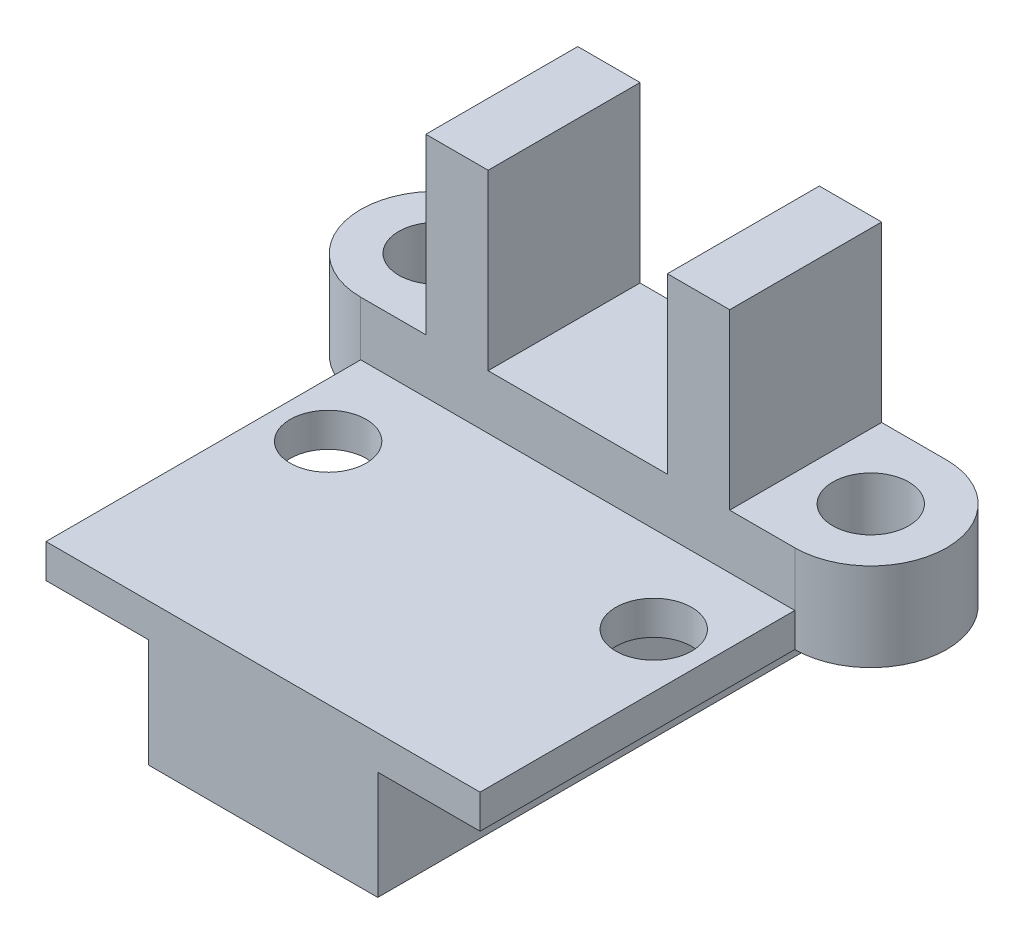
ISO-10303-21;
HEADER;
FILE_DESCRIPTION(('STEP AP214'),'2;1');
FILE_NAME('part.step','',(''),(''),'','','');
FILE_SCHEMA(('AUTOMOTIVE_DESIGN { 1 0 10303 214 1 1 1 1 }'));
ENDSEC;
DATA;
#1=APPLICATION_CONTEXT('core data for automotive mechanical design processes');
#2=APPLICATION_PROTOCOL_DEFINITION('international standard','automotive_design',2000,#1);
#3=PRODUCT_CONTEXT('',#1,'mechanical');
#4=PRODUCT('Part','Part','',(#3));
#5=PRODUCT_RELATED_PRODUCT_CATEGORY('part','',(#4));
#6=PRODUCT_DEFINITION_FORMATION('','',#4);
#7=PRODUCT_DEFINITION_CONTEXT('part definition',#1,'design');
#8=PRODUCT_DEFINITION('design','',#6,#7);
#9=PRODUCT_DEFINITION_SHAPE('','',#8);
#10=(LENGTH_UNIT() NAMED_UNIT(*) SI_UNIT(.MILLI.,.METRE.));
#11=(NAMED_UNIT(*) PLANE_ANGLE_UNIT() SI_UNIT($,.RADIAN.));
#12=(NAMED_UNIT(*) SI_UNIT($,.STERADIAN.) SOLID_ANGLE_UNIT());
#13=UNCERTAINTY_MEASURE_WITH_UNIT(LENGTH_MEASURE(1.E-05),#10,'distance_accuracy_value','');
#14=(GEOMETRIC_REPRESENTATION_CONTEXT(3) GLOBAL_UNCERTAINTY_ASSIGNED_CONTEXT((#13)) GLOBAL_UNIT_ASSIGNED_CONTEXT((#10,
#11,#12)) REPRESENTATION_CONTEXT('',''));
#15=CARTESIAN_POINT('',(0.,0.,0.));
#16=DIRECTION('',(0.,0.,1.));
#17=DIRECTION('',(1.,0.,0.));
#18=AXIS2_PLACEMENT_3D('',#15,#16,#17);
#19=CARTESIAN_POINT('',(10.,0.,-10.75));
#20=DIRECTION('',(0.,1.,0.));
#21=DIRECTION('',(0.,0.,1.));
#22=AXIS2_PLACEMENT_3D('',#19,#20,#21);
#23=PLANE('',#22);
#24=CARTESIAN_POINT('',(7.5,0.,-3.25));
#25=DIRECTION('',(0.,1.,0.));
#26=DIRECTION('',(0.,0.,1.));
#27=AXIS2_PLACEMENT_3D('',#24,#25,#26);
#28=CIRCLE('',#27,1.75);
#29=CARTESIAN_POINT('',(7.5,0.,-5.));
#30=VERTEX_POINT('',#29);
#31=EDGE_CURVE('E341',#30,#30,#28,.T.);
#32=ORIENTED_EDGE('',*,*,#31,.T.);
#33=EDGE_LOOP('',(#32));
#34=FACE_BOUND('',#33,.T.);
#35=CARTESIAN_POINT('',(10.,0.,-10.75));
#36=DIRECTION('',(0.,1.,0.));
#37=DIRECTION('',(0.,0.,1.));
#38=AXIS2_PLACEMENT_3D('',#35,#36,#37);
#39=CIRCLE('',#38,1.75);
#40=CARTESIAN_POINT('',(10.,0.,-12.5));
#41=VERTEX_POINT('',#40);
#42=EDGE_CURVE('E331',#41,#41,#39,.T.);
#43=ORIENTED_EDGE('',*,*,#42,.T.);
#44=EDGE_LOOP('',(#43));
#45=FACE_BOUND('',#44,.T.);
#46=DIRECTION('',(0.,0.,1.));
#47=VECTOR('',#46,1.);
#48=CARTESIAN_POINT('',(5.28598469809103,0.,-14.25));
#49=LINE('',#48,#47);
#50=CARTESIAN_POINT('',(5.28598469809103,0.,-14.25));
#51=VERTEX_POINT('',#50);
#52=CARTESIAN_POINT('',(5.28598469809103,0.,7.25));
#53=VERTEX_POINT('',#52);
#54=EDGE_CURVE('E50',#51,#53,#49,.T.);
#55=ORIENTED_EDGE('',*,*,#54,.F.);
#56=DIRECTION('',(-1.,0.,0.));
#57=VECTOR('',#56,1.);
#58=CARTESIAN_POINT('',(-10.,0.,-14.25));
#59=LINE('',#58,#57);
#60=CARTESIAN_POINT('',(10.,0.,-14.25));
#61=VERTEX_POINT('',#60);
#62=EDGE_CURVE('E216',#61,#51,#59,.T.);
#63=ORIENTED_EDGE('',*,*,#62,.F.);
#64=CARTESIAN_POINT('',(10.,0.,-10.75));
#65=DIRECTION('',(0.,1.,0.));
#66=DIRECTION('',(0.,0.,1.));
#67=AXIS2_PLACEMENT_3D('',#64,#65,#66);
#68=CIRCLE('',#67,3.50000000000001);
#69=CARTESIAN_POINT('',(10.,0.,-7.25));
#70=VERTEX_POINT('',#69);
#71=EDGE_CURVE('E217',#70,#61,#68,.T.);
#72=ORIENTED_EDGE('',*,*,#71,.F.);
#73=DIRECTION('',(0.,0.,-1.));
#74=VECTOR('',#73,1.);
#75=CARTESIAN_POINT('',(10.,0.,7.25));
#76=LINE('',#75,#74);
#77=CARTESIAN_POINT('',(10.,0.,7.25));
#78=VERTEX_POINT('',#77);
#79=EDGE_CURVE('E230',#78,#70,#76,.T.);
#80=ORIENTED_EDGE('',*,*,#79,.F.);
#81=DIRECTION('',(1.,0.,0.));
#82=VECTOR('',#81,1.);
#83=CARTESIAN_POINT('',(-10.,0.,7.25));
#84=LINE('',#83,#82);
#85=EDGE_CURVE('E55',#53,#78,#84,.T.);
#86=ORIENTED_EDGE('',*,*,#85,.F.);
#87=EDGE_LOOP('',(#55,#63,#72,#80,#86));
#88=FACE_BOUND('',#87,.T.);
#89=ADVANCED_FACE('F33',(#34,#45,#88),#23,.F.);
#90=CARTESIAN_POINT('',(-10.,0.,-10.75));
#91=DIRECTION('',(0.,1.,0.));
#92=DIRECTION('',(0.,0.,1.));
#93=AXIS2_PLACEMENT_3D('',#90,#91,#92);
#94=CIRCLE('',#93,1.75);
#95=CARTESIAN_POINT('',(-10.,0.,-12.5));
#96=VERTEX_POINT('',#95);
#97=EDGE_CURVE('E328',#96,#96,#94,.T.);
#98=ORIENTED_EDGE('',*,*,#97,.T.);
#99=EDGE_LOOP('',(#98));
#100=FACE_BOUND('',#99,.T.);
#101=CARTESIAN_POINT('',(-7.5,0.,-3.25));
#102=DIRECTION('',(0.,1.,0.));
#103=DIRECTION('',(0.,0.,1.));
#104=AXIS2_PLACEMENT_3D('',#101,#102,#103);
#105=CIRCLE('',#104,1.75);
#106=CARTESIAN_POINT('',(-7.5,0.,-5.));
#107=VERTEX_POINT('',#106);
#108=EDGE_CURVE('E335',#107,#107,#105,.T.);
#109=ORIENTED_EDGE('',*,*,#108,.T.);
#110=EDGE_LOOP('',(#109));
#111=FACE_BOUND('',#110,.T.);
#112=DIRECTION('',(0.,0.,-1.));
#113=VECTOR('',#112,1.);
#114=CARTESIAN_POINT('',(-5.28598469809103,0.,-7.25));
#115=LINE('',#114,#113);
#116=CARTESIAN_POINT('',(-5.28598469809103,0.,7.25));
#117=VERTEX_POINT('',#116);
#118=CARTESIAN_POINT('',(-5.28598469809103,0.,-14.25));
#119=VERTEX_POINT('',#118);
#120=EDGE_CURVE('E207',#117,#119,#115,.T.);
#121=ORIENTED_EDGE('',*,*,#120,.F.);
#122=CARTESIAN_POINT('',(-10.,0.,7.25));
#123=VERTEX_POINT('',#122);
#124=EDGE_CURVE('E234',#123,#117,#84,.T.);
#125=ORIENTED_EDGE('',*,*,#124,.F.);
#126=DIRECTION('',(0.,0.,1.));
#127=VECTOR('',#126,1.);
#128=CARTESIAN_POINT('',(-10.,0.,7.25));
#129=LINE('',#128,#127);
#130=CARTESIAN_POINT('',(-10.,0.,-7.25));
#131=VERTEX_POINT('',#130);
#132=EDGE_CURVE('E226',#131,#123,#129,.T.);
#133=ORIENTED_EDGE('',*,*,#132,.F.);
#134=CARTESIAN_POINT('',(-10.,0.,-10.75));
#135=DIRECTION('',(0.,1.,0.));
#136=DIRECTION('',(0.,0.,1.));
#137=AXIS2_PLACEMENT_3D('',#134,#135,#136);
#138=CIRCLE('',#137,3.5);
#139=CARTESIAN_POINT('',(-10.,0.,-14.25));
#140=VERTEX_POINT('',#139);
#141=EDGE_CURVE('E223',#140,#131,#138,.T.);
#142=ORIENTED_EDGE('',*,*,#141,.F.);
#143=EDGE_CURVE('E210',#119,#140,#59,.T.);
#144=ORIENTED_EDGE('',*,*,#143,.F.);
#145=EDGE_LOOP('',(#121,#125,#133,#142,#144));
#146=FACE_BOUND('',#145,.T.);
#147=ADVANCED_FACE('F380',(#100,#111,#146),#23,.F.);
#148=CARTESIAN_POINT('',(0.,12.06,0.));
#149=DIRECTION('',(0.,-1.,0.));
#150=DIRECTION('',(0.,0.,-1.));
#151=AXIS2_PLACEMENT_3D('',#148,#149,#150);
#152=PLANE('',#151);
#153=DIRECTION('',(-1.,0.,0.));
#154=VECTOR('',#153,1.);
#155=CARTESIAN_POINT('',(-7.,12.06,-14.25));
#156=LINE('',#155,#154);
#157=CARTESIAN_POINT('',(7.,12.06,-14.25));
#158=VERTEX_POINT('',#157);
#159=CARTESIAN_POINT('',(4.13,12.06,-14.25));
#160=VERTEX_POINT('',#159);
#161=EDGE_CURVE('E411',#158,#160,#156,.T.);
#162=ORIENTED_EDGE('',*,*,#161,.T.);
#163=DIRECTION('',(0.,0.,-1.));
#164=VECTOR('',#163,1.);
#165=CARTESIAN_POINT('',(4.13,12.06,-7.25));
#166=LINE('',#165,#164);
#167=CARTESIAN_POINT('',(4.13,12.06,-7.25));
#168=VERTEX_POINT('',#167);
#169=EDGE_CURVE('E186',#168,#160,#166,.T.);
#170=ORIENTED_EDGE('',*,*,#169,.F.);
#171=DIRECTION('',(1.,0.,0.));
#172=VECTOR('',#171,1.);
#173=CARTESIAN_POINT('',(-7.,12.06,-7.25000000000001));
#174=LINE('',#173,#172);
#175=CARTESIAN_POINT('',(7.,12.06,-7.25000000000001));
#176=VERTEX_POINT('',#175);
#177=EDGE_CURVE('E405',#168,#176,#174,.T.);
#178=ORIENTED_EDGE('',*,*,#177,.T.);
#179=DIRECTION('',(0.,0.,-1.));
#180=VECTOR('',#179,1.);
#181=CARTESIAN_POINT('',(7.,12.06,-7.25000000000001));
#182=LINE('',#181,#180);
#183=EDGE_CURVE('E263',#176,#158,#182,.T.);
#184=ORIENTED_EDGE('',*,*,#183,.T.);
#185=EDGE_LOOP('',(#162,#170,#178,#184));
#186=FACE_BOUND('',#185,.T.);
#187=ADVANCED_FACE('F447',(#186),#152,.F.);
#188=CARTESIAN_POINT('',(-10.,4.06,-10.75));
#189=DIRECTION('',(0.,1.,0.));
#190=DIRECTION('',(0.,0.,1.));
#191=AXIS2_PLACEMENT_3D('',#188,#189,#190);
#192=PLANE('',#191);
#193=DIRECTION('',(0.,0.,-1.));
#194=VECTOR('',#193,1.);
#195=CARTESIAN_POINT('',(7.,4.06,-7.25000000000001));
#196=LINE('',#195,#194);
#197=CARTESIAN_POINT('',(7.,4.06,-7.25000000000001));
#198=VERTEX_POINT('',#197);
#199=CARTESIAN_POINT('',(7.,4.06,-14.25));
#200=VERTEX_POINT('',#199);
#201=EDGE_CURVE('E243',#198,#200,#196,.T.);
#202=ORIENTED_EDGE('',*,*,#201,.F.);
#203=DIRECTION('',(1.,0.,0.));
#204=VECTOR('',#203,1.);
#205=CARTESIAN_POINT('',(-10.,4.06,-7.25000000000001));
#206=LINE('',#205,#204);
#207=CARTESIAN_POINT('',(10.,4.06,-7.25000000000001));
#208=VERTEX_POINT('',#207);
#209=EDGE_CURVE('E294',#198,#208,#206,.T.);
#210=ORIENTED_EDGE('',*,*,#209,.T.);
#211=CARTESIAN_POINT('',(10.,4.06,-10.75));
#212=DIRECTION('',(0.,1.,0.));
#213=DIRECTION('',(0.,0.,1.));
#214=AXIS2_PLACEMENT_3D('',#211,#212,#213);
#215=CIRCLE('',#214,3.5);
#216=CARTESIAN_POINT('',(10.,4.06,-14.25));
#217=VERTEX_POINT('',#216);
#218=EDGE_CURVE('E297',#208,#217,#215,.T.);
#219=ORIENTED_EDGE('',*,*,#218,.T.);
#220=DIRECTION('',(-1.,0.,0.));
#221=VECTOR('',#220,1.);
#222=CARTESIAN_POINT('',(-10.,4.06,-14.25));
#223=LINE('',#222,#221);
#224=EDGE_CURVE('E350',#217,#200,#223,.T.);
#225=ORIENTED_EDGE('',*,*,#224,.T.);
#226=EDGE_LOOP('',(#202,#210,#219,#225));
#227=FACE_BOUND('',#226,.T.);
#228=CARTESIAN_POINT('',(10.,4.06,-10.75));
#229=DIRECTION('',(0.,1.,0.));
#230=DIRECTION('',(0.,0.,1.));
#231=AXIS2_PLACEMENT_3D('',#228,#229,#230);
#232=CIRCLE('',#231,1.75);
#233=CARTESIAN_POINT('',(10.,4.06,-12.5));
#234=VERTEX_POINT('',#233);
#235=EDGE_CURVE('E257',#234,#234,#232,.T.);
#236=ORIENTED_EDGE('',*,*,#235,.F.);
#237=EDGE_LOOP('',(#236));
#238=FACE_BOUND('',#237,.T.);
#239=ADVANCED_FACE('F359',(#227,#238),#192,.T.);
#240=CARTESIAN_POINT('',(10.,1.56,-10.75));
#241=DIRECTION('',(0.,1.,0.));
#242=DIRECTION('',(0.,0.,1.));
#243=AXIS2_PLACEMENT_3D('',#240,#241,#242);
#244=PLANE('',#243);
#245=DIRECTION('',(1.,0.,0.));
#246=VECTOR('',#245,1.);
#247=CARTESIAN_POINT('',(-10.,1.56,-7.25000000000001));
#248=LINE('',#247,#246);
#249=CARTESIAN_POINT('',(-10.,1.56,-7.25));
#250=VERTEX_POINT('',#249);
#251=CARTESIAN_POINT('',(10.,1.56,-7.25000000000001));
#252=VERTEX_POINT('',#251);
#253=EDGE_CURVE('E285',#250,#252,#248,.T.);
#254=ORIENTED_EDGE('',*,*,#253,.F.);
#255=DIRECTION('',(0.,0.,1.));
#256=VECTOR('',#255,1.);
#257=CARTESIAN_POINT('',(-10.,1.56,7.25));
#258=LINE('',#257,#256);
#259=CARTESIAN_POINT('',(-10.,1.56,7.25));
#260=VERTEX_POINT('',#259);
#261=EDGE_CURVE('E324',#250,#260,#258,.T.);
#262=ORIENTED_EDGE('',*,*,#261,.T.);
#263=DIRECTION('',(1.,0.,0.));
#264=VECTOR('',#263,1.);
#265=CARTESIAN_POINT('',(-10.,1.56,7.25));
#266=LINE('',#265,#264);
#267=CARTESIAN_POINT('',(10.,1.56,7.25));
#268=VERTEX_POINT('',#267);
#269=EDGE_CURVE('E321',#260,#268,#266,.T.);
#270=ORIENTED_EDGE('',*,*,#269,.T.);
#271=DIRECTION('',(0.,0.,-1.));
#272=VECTOR('',#271,1.);
#273=CARTESIAN_POINT('',(10.,1.56,7.25));
#274=LINE('',#273,#272);
#275=EDGE_CURVE('E315',#268,#252,#274,.T.);
#276=ORIENTED_EDGE('',*,*,#275,.T.);
#277=EDGE_LOOP('',(#254,#262,#270,#276));
#278=FACE_BOUND('',#277,.T.);
#279=CARTESIAN_POINT('',(-7.5,1.56,-3.25));
#280=DIRECTION('',(0.,1.,0.));
#281=DIRECTION('',(0.,0.,1.));
#282=AXIS2_PLACEMENT_3D('',#279,#280,#281);
#283=CIRCLE('',#282,1.75);
#284=CARTESIAN_POINT('',(-7.5,1.56,-5.));
#285=VERTEX_POINT('',#284);
#286=EDGE_CURVE('E334',#285,#285,#283,.T.);
#287=ORIENTED_EDGE('',*,*,#286,.F.);
#288=EDGE_LOOP('',(#287));
#289=FACE_BOUND('',#288,.T.);
#290=CARTESIAN_POINT('',(7.5,1.56,-3.25));
#291=DIRECTION('',(0.,1.,0.));
#292=DIRECTION('',(0.,0.,1.));
#293=AXIS2_PLACEMENT_3D('',#290,#291,#292);
#294=CIRCLE('',#293,1.75);
#295=CARTESIAN_POINT('',(7.5,1.56,-5.));
#296=VERTEX_POINT('',#295);
#297=EDGE_CURVE('E338',#296,#296,#294,.T.);
#298=ORIENTED_EDGE('',*,*,#297,.F.);
#299=EDGE_LOOP('',(#298));
#300=FACE_BOUND('',#299,.T.);
#301=ADVANCED_FACE('F371',(#278,#289,#300),#244,.T.);
#302=CARTESIAN_POINT('',(10.,1.56,-10.75));
#303=DIRECTION('',(0.,-1.,0.));
#304=DIRECTION('',(0.,0.,-1.));
#305=AXIS2_PLACEMENT_3D('',#302,#303,#304);
#306=CYLINDRICAL_SURFACE('',#305,3.50000000000001);
#307=ORIENTED_EDGE('',*,*,#71,.T.);
#308=DIRECTION('',(0.,-1.,0.));
#309=VECTOR('',#308,1.);
#310=CARTESIAN_POINT('',(10.,1.56,-14.25));
#311=LINE('',#310,#309);
#312=EDGE_CURVE('E11',#217,#61,#311,.T.);
#313=ORIENTED_EDGE('',*,*,#312,.F.);
#314=ORIENTED_EDGE('',*,*,#218,.F.);
#315=DIRECTION('',(0.,-1.,0.));
#316=VECTOR('',#315,1.);
#317=CARTESIAN_POINT('',(10.,4.06,-7.25000000000001));
#318=LINE('',#317,#316);
#319=EDGE_CURVE('E349',#208,#252,#318,.T.);
#320=ORIENTED_EDGE('',*,*,#319,.T.);
#321=DIRECTION('',(0.,-1.,0.));
#322=VECTOR('',#321,1.);
#323=CARTESIAN_POINT('',(10.,1.56,-7.25));
#324=LINE('',#323,#322);
#325=EDGE_CURVE('E313',#252,#70,#324,.T.);
#326=ORIENTED_EDGE('',*,*,#325,.T.);
#327=EDGE_LOOP('',(#307,#313,#314,#320,#326));
#328=FACE_BOUND('',#327,.T.);
#329=ADVANCED_FACE('F35',(#328),#306,.T.);
#330=CARTESIAN_POINT('',(-10.,1.56,-14.25));
#331=DIRECTION('',(0.,0.,1.));
#332=DIRECTION('',(1.,0.,0.));
#333=AXIS2_PLACEMENT_3D('',#330,#331,#332);
#334=PLANE('',#333);
#335=DIRECTION('',(-1.,0.,0.));
#336=VECTOR('',#335,1.);
#337=CARTESIAN_POINT('',(-4.13,4.06,-14.25));
#338=LINE('',#337,#336);
#339=CARTESIAN_POINT('',(4.13,4.06,-14.25));
#340=VERTEX_POINT('',#339);
#341=CARTESIAN_POINT('',(-4.13,4.06,-14.25));
#342=VERTEX_POINT('',#341);
#343=EDGE_CURVE('E432',#340,#342,#338,.T.);
#344=ORIENTED_EDGE('',*,*,#343,.F.);
#345=DIRECTION('',(0.,1.,0.));
#346=VECTOR('',#345,1.);
#347=CARTESIAN_POINT('',(4.13,4.06,-14.25));
#348=LINE('',#347,#346);
#349=EDGE_CURVE('E417',#340,#160,#348,.T.);
#350=ORIENTED_EDGE('',*,*,#349,.T.);
#351=ORIENTED_EDGE('',*,*,#161,.F.);
#352=DIRECTION('',(0.,-1.,0.));
#353=VECTOR('',#352,1.);
#354=CARTESIAN_POINT('',(7.,12.06,-14.25));
#355=LINE('',#354,#353);
#356=EDGE_CURVE('E274',#158,#200,#355,.T.);
#357=ORIENTED_EDGE('',*,*,#356,.T.);
#358=ORIENTED_EDGE('',*,*,#224,.F.);
#359=ORIENTED_EDGE('',*,*,#312,.T.);
#360=ORIENTED_EDGE('',*,*,#62,.T.);
#361=DIRECTION('',(0.,1.,0.));
#362=VECTOR('',#361,1.);
#363=CARTESIAN_POINT('',(5.28598469809103,-5.,-14.25));
#364=LINE('',#363,#362);
#365=CARTESIAN_POINT('',(5.28598469809103,-5.,-14.25));
#366=VERTEX_POINT('',#365);
#367=EDGE_CURVE('E197',#366,#51,#364,.T.);
#368=ORIENTED_EDGE('',*,*,#367,.F.);
#369=DIRECTION('',(1.,0.,0.));
#370=VECTOR('',#369,1.);
#371=CARTESIAN_POINT('',(-5.28598469809103,-5.,-14.25));
#372=LINE('',#371,#370);
#373=CARTESIAN_POINT('',(-5.28598469809103,-5.,-14.25));
#374=VERTEX_POINT('',#373);
#375=EDGE_CURVE('E180',#374,#366,#372,.T.);
#376=ORIENTED_EDGE('',*,*,#375,.F.);
#377=DIRECTION('',(0.,1.,0.));
#378=VECTOR('',#377,1.);
#379=CARTESIAN_POINT('',(-5.28598469809103,-5.,-14.25));
#380=LINE('',#379,#378);
#381=EDGE_CURVE('E190',#374,#119,#380,.T.);
#382=ORIENTED_EDGE('',*,*,#381,.T.);
#383=ORIENTED_EDGE('',*,*,#143,.T.);
#384=DIRECTION('',(0.,-1.,0.));
#385=VECTOR('',#384,1.);
#386=CARTESIAN_POINT('',(-10.,1.56,-14.25));
#387=LINE('',#386,#385);
#388=CARTESIAN_POINT('',(-10.,4.06,-14.25));
#389=VERTEX_POINT('',#388);
#390=EDGE_CURVE('E42',#389,#140,#387,.T.);
#391=ORIENTED_EDGE('',*,*,#390,.F.);
#392=CARTESIAN_POINT('',(-7.,4.06,-14.25));
#393=VERTEX_POINT('',#392);
#394=EDGE_CURVE('E264',#393,#389,#223,.T.);
#395=ORIENTED_EDGE('',*,*,#394,.F.);
#396=DIRECTION('',(0.,-1.,0.));
#397=VECTOR('',#396,1.);
#398=CARTESIAN_POINT('',(-7.,12.06,-14.25));
#399=LINE('',#398,#397);
#400=CARTESIAN_POINT('',(-7.,12.06,-14.25));
#401=VERTEX_POINT('',#400);
#402=EDGE_CURVE('E269',#401,#393,#399,.T.);
#403=ORIENTED_EDGE('',*,*,#402,.F.);
#404=CARTESIAN_POINT('',(-4.13,12.06,-14.25));
#405=VERTEX_POINT('',#404);
#406=EDGE_CURVE('E413',#405,#401,#156,.T.);
#407=ORIENTED_EDGE('',*,*,#406,.F.);
#408=DIRECTION('',(0.,1.,0.));
#409=VECTOR('',#408,1.);
#410=CARTESIAN_POINT('',(-4.13,4.06,-14.25));
#411=LINE('',#410,#409);
#412=EDGE_CURVE('E420',#342,#405,#411,.T.);
#413=ORIENTED_EDGE('',*,*,#412,.F.);
#414=EDGE_LOOP('',(#344,#350,#351,#357,#358,#359,#360,#368,#376,#382,#383,#391,#395,#403,#407,#413));
#415=FACE_BOUND('',#414,.T.);
#416=ADVANCED_FACE('F364',(#415),#334,.F.);
#417=CARTESIAN_POINT('',(-10.,1.56,-10.75));
#418=DIRECTION('',(0.,-1.,0.));
#419=DIRECTION('',(0.,0.,-1.));
#420=AXIS2_PLACEMENT_3D('',#417,#418,#419);
#421=CYLINDRICAL_SURFACE('',#420,3.5);
#422=ORIENTED_EDGE('',*,*,#141,.T.);
#423=DIRECTION('',(0.,-1.,0.));
#424=VECTOR('',#423,1.);
#425=CARTESIAN_POINT('',(-10.,1.56,-7.25));
#426=LINE('',#425,#424);
#427=EDGE_CURVE('E305',#250,#131,#426,.T.);
#428=ORIENTED_EDGE('',*,*,#427,.F.);
#429=DIRECTION('',(0.,-1.,0.));
#430=VECTOR('',#429,1.);
#431=CARTESIAN_POINT('',(-10.,4.06,-7.25000000000001));
#432=LINE('',#431,#430);
#433=CARTESIAN_POINT('',(-10.,4.06,-7.25000000000001));
#434=VERTEX_POINT('',#433);
#435=EDGE_CURVE('E344',#434,#250,#432,.T.);
#436=ORIENTED_EDGE('',*,*,#435,.F.);
#437=CARTESIAN_POINT('',(-10.,4.06,-10.75));
#438=DIRECTION('',(0.,1.,0.));
#439=DIRECTION('',(0.,0.,1.));
#440=AXIS2_PLACEMENT_3D('',#437,#438,#439);
#441=CIRCLE('',#440,3.5);
#442=EDGE_CURVE('E289',#389,#434,#441,.T.);
#443=ORIENTED_EDGE('',*,*,#442,.F.);
#444=ORIENTED_EDGE('',*,*,#390,.T.);
#445=EDGE_LOOP('',(#422,#428,#436,#443,#444));
#446=FACE_BOUND('',#445,.T.);
#447=ADVANCED_FACE('F386',(#446),#421,.T.);
#448=CARTESIAN_POINT('',(-10.,1.56,7.25));
#449=DIRECTION('',(1.,0.,0.));
#450=DIRECTION('',(0.,0.,-1.));
#451=AXIS2_PLACEMENT_3D('',#448,#449,#450);
#452=PLANE('',#451);
#453=ORIENTED_EDGE('',*,*,#132,.T.);
#454=DIRECTION('',(0.,-1.,0.));
#455=VECTOR('',#454,1.);
#456=CARTESIAN_POINT('',(-10.,1.56,7.25));
#457=LINE('',#456,#455);
#458=EDGE_CURVE('E308',#260,#123,#457,.T.);
#459=ORIENTED_EDGE('',*,*,#458,.F.);
#460=ORIENTED_EDGE('',*,*,#261,.F.);
#461=ORIENTED_EDGE('',*,*,#427,.T.);
#462=EDGE_LOOP('',(#453,#459,#460,#461));
#463=FACE_BOUND('',#462,.T.);
#464=ADVANCED_FACE('F376',(#463),#452,.F.);
#465=CARTESIAN_POINT('',(-10.,1.56,7.25));
#466=DIRECTION('',(0.,0.,-1.));
#467=DIRECTION('',(-1.,0.,0.));
#468=AXIS2_PLACEMENT_3D('',#465,#466,#467);
#469=PLANE('',#468);
#470=ORIENTED_EDGE('',*,*,#124,.T.);
#471=DIRECTION('',(0.,1.,0.));
#472=VECTOR('',#471,1.);
#473=CARTESIAN_POINT('',(-5.28598469809103,-5.,7.25));
#474=LINE('',#473,#472);
#475=CARTESIAN_POINT('',(-5.28598469809103,-5.,7.25));
#476=VERTEX_POINT('',#475);
#477=EDGE_CURVE('E171',#476,#117,#474,.T.);
#478=ORIENTED_EDGE('',*,*,#477,.F.);
#479=DIRECTION('',(-1.,0.,0.));
#480=VECTOR('',#479,1.);
#481=CARTESIAN_POINT('',(-5.28598469809103,-5.,7.25));
#482=LINE('',#481,#480);
#483=CARTESIAN_POINT('',(5.28598469809103,-5.,7.25));
#484=VERTEX_POINT('',#483);
#485=EDGE_CURVE('E164',#484,#476,#482,.T.);
#486=ORIENTED_EDGE('',*,*,#485,.F.);
#487=DIRECTION('',(0.,1.,0.));
#488=VECTOR('',#487,1.);
#489=CARTESIAN_POINT('',(5.28598469809103,-5.,7.25));
#490=LINE('',#489,#488);
#491=EDGE_CURVE('E169',#484,#53,#490,.T.);
#492=ORIENTED_EDGE('',*,*,#491,.T.);
#493=ORIENTED_EDGE('',*,*,#85,.T.);
#494=DIRECTION('',(0.,-1.,0.));
#495=VECTOR('',#494,1.);
#496=CARTESIAN_POINT('',(10.,1.56,7.25));
#497=LINE('',#496,#495);
#498=EDGE_CURVE('E311',#268,#78,#497,.T.);
#499=ORIENTED_EDGE('',*,*,#498,.F.);
#500=ORIENTED_EDGE('',*,*,#269,.F.);
#501=ORIENTED_EDGE('',*,*,#458,.T.);
#502=EDGE_LOOP('',(#470,#478,#486,#492,#493,#499,#500,#501));
#503=FACE_BOUND('',#502,.T.);
#504=ADVANCED_FACE('F167',(#503),#469,.F.);
#505=CARTESIAN_POINT('',(10.,1.56,7.25));
#506=DIRECTION('',(-1.,0.,0.));
#507=DIRECTION('',(0.,0.,1.));
#508=AXIS2_PLACEMENT_3D('',#505,#506,#507);
#509=PLANE('',#508);
#510=ORIENTED_EDGE('',*,*,#79,.T.);
#511=ORIENTED_EDGE('',*,*,#325,.F.);
#512=ORIENTED_EDGE('',*,*,#275,.F.);
#513=ORIENTED_EDGE('',*,*,#498,.T.);
#514=EDGE_LOOP('',(#510,#511,#512,#513));
#515=FACE_BOUND('',#514,.T.);
#516=ADVANCED_FACE('F366',(#515),#509,.F.);
#517=CARTESIAN_POINT('',(-10.,1.56,-10.75));
#518=DIRECTION('',(0.,-1.,0.));
#519=DIRECTION('',(0.,0.,-1.));
#520=AXIS2_PLACEMENT_3D('',#517,#518,#519);
#521=CYLINDRICAL_SURFACE('',#520,1.75);
#522=CARTESIAN_POINT('',(-10.,4.06,-10.75));
#523=DIRECTION('',(0.,1.,0.));
#524=DIRECTION('',(0.,0.,1.));
#525=AXIS2_PLACEMENT_3D('',#522,#523,#524);
#526=CIRCLE('',#525,1.75);
#527=CARTESIAN_POINT('',(-10.,4.06,-12.5));
#528=VERTEX_POINT('',#527);
#529=EDGE_CURVE('E281',#528,#528,#526,.T.);
#530=CARTESIAN_POINT('',(-10.,0.,-12.5));
#531=CARTESIAN_POINT('',(-10.,0.0422916666666667,-12.5));
#532=CARTESIAN_POINT('',(-10.,0.0845833333333334,-12.5));
#533=CARTESIAN_POINT('',(-10.,0.169166666666667,-12.5));
#534=CARTESIAN_POINT('',(-10.,0.211458333333333,-12.5));
#535=CARTESIAN_POINT('',(-10.,0.296041666666667,-12.5));
#536=CARTESIAN_POINT('',(-10.,0.338333333333333,-12.5));
#537=CARTESIAN_POINT('',(-10.,0.422916666666667,-12.5));
#538=CARTESIAN_POINT('',(-10.,0.465208333333334,-12.5));
#539=CARTESIAN_POINT('',(-10.,0.549791666666667,-12.5));
#540=CARTESIAN_POINT('',(-10.,0.592083333333333,-12.5));
#541=CARTESIAN_POINT('',(-10.,0.676666666666667,-12.5));
#542=CARTESIAN_POINT('',(-10.,0.718958333333333,-12.5));
#543=CARTESIAN_POINT('',(-10.,0.803541666666667,-12.5));
#544=CARTESIAN_POINT('',(-10.,0.845833333333333,-12.5));
#545=CARTESIAN_POINT('',(-10.,0.930416666666667,-12.5));
#546=CARTESIAN_POINT('',(-10.,0.972708333333334,-12.5));
#547=CARTESIAN_POINT('',(-10.,1.05729166666667,-12.5));
#548=CARTESIAN_POINT('',(-10.,1.09958333333333,-12.5));
#549=CARTESIAN_POINT('',(-10.,1.18416666666667,-12.5));
#550=CARTESIAN_POINT('',(-10.,1.22645833333333,-12.5));
#551=CARTESIAN_POINT('',(-10.,1.31104166666667,-12.5));
#552=CARTESIAN_POINT('',(-10.,1.35333333333333,-12.5));
#553=CARTESIAN_POINT('',(-10.,1.43791666666667,-12.5));
#554=CARTESIAN_POINT('',(-10.,1.48020833333333,-12.5));
#555=CARTESIAN_POINT('',(-10.,1.56479166666667,-12.5));
#556=CARTESIAN_POINT('',(-10.,1.60708333333333,-12.5));
#557=CARTESIAN_POINT('',(-10.,1.69166666666667,-12.5));
#558=CARTESIAN_POINT('',(-10.,1.73395833333333,-12.5));
#559=CARTESIAN_POINT('',(-10.,1.81854166666667,-12.5));
#560=CARTESIAN_POINT('',(-10.,1.86083333333333,-12.5));
#561=CARTESIAN_POINT('',(-10.,1.94541666666667,-12.5));
#562=CARTESIAN_POINT('',(-10.,1.98770833333333,-12.5));
#563=CARTESIAN_POINT('',(-10.,2.07229166666667,-12.5));
#564=CARTESIAN_POINT('',(-10.,2.11458333333333,-12.5));
#565=CARTESIAN_POINT('',(-10.,2.19916666666667,-12.5));
#566=CARTESIAN_POINT('',(-10.,2.24145833333333,-12.5));
#567=CARTESIAN_POINT('',(-10.,2.32604166666667,-12.5));
#568=CARTESIAN_POINT('',(-10.,2.36833333333333,-12.5));
#569=CARTESIAN_POINT('',(-10.,2.45291666666667,-12.5));
#570=CARTESIAN_POINT('',(-10.,2.49520833333333,-12.5));
#571=CARTESIAN_POINT('',(-10.,2.57979166666667,-12.5));
#572=CARTESIAN_POINT('',(-10.,2.62208333333333,-12.5));
#573=CARTESIAN_POINT('',(-10.,2.70666666666667,-12.5));
#574=CARTESIAN_POINT('',(-10.,2.74895833333333,-12.5));
#575=CARTESIAN_POINT('',(-10.,2.83354166666667,-12.5));
#576=CARTESIAN_POINT('',(-10.,2.87583333333333,-12.5));
#577=CARTESIAN_POINT('',(-10.,2.96041666666667,-12.5));
#578=CARTESIAN_POINT('',(-10.,3.00270833333333,-12.5));
#579=CARTESIAN_POINT('',(-10.,3.08729166666667,-12.5));
#580=CARTESIAN_POINT('',(-10.,3.12958333333333,-12.5));
#581=CARTESIAN_POINT('',(-10.,3.21416666666667,-12.5));
#582=CARTESIAN_POINT('',(-10.,3.25645833333333,-12.5));
#583=CARTESIAN_POINT('',(-10.,3.34104166666667,-12.5));
#584=CARTESIAN_POINT('',(-10.,3.38333333333333,-12.5));
#585=CARTESIAN_POINT('',(-10.,3.46791666666667,-12.5));
#586=CARTESIAN_POINT('',(-10.,3.51020833333333,-12.5));
#587=CARTESIAN_POINT('',(-10.,3.59479166666667,-12.5));
#588=CARTESIAN_POINT('',(-10.,3.63708333333333,-12.5));
#589=CARTESIAN_POINT('',(-10.,3.72166666666667,-12.5));
#590=CARTESIAN_POINT('',(-10.,3.76395833333333,-12.5));
#591=CARTESIAN_POINT('',(-10.,3.84854166666667,-12.5));
#592=CARTESIAN_POINT('',(-10.,3.89083333333333,-12.5));
#593=CARTESIAN_POINT('',(-10.,3.97541666666667,-12.5));
#594=CARTESIAN_POINT('',(-10.,4.01770833333333,-12.5));
#595=CARTESIAN_POINT('',(-10.,4.06,-12.5));
#596=B_SPLINE_CURVE_WITH_KNOTS('',3,(#530,#531,#532,#533,#534,#535,#536,#537,#538,#539,#540,
#541,#542,#543,#544,#545,#546,#547,#548,#549,#550,#551,#552,#553,#554,#555,#556,#557,#558,#559,
#560,#561,#562,#563,#564,#565,#566,#567,#568,#569,#570,#571,#572,#573,#574,#575,#576,#577,#578,
#579,#580,#581,#582,#583,#584,#585,#586,#587,#588,#589,#590,#591,#592,#593,#594,#595),
.UNSPECIFIED.,.F.,.F.,(4,2,2,2,2,2,2,2,2,2,2,2,2,2,2,2,2,2,2,2,2,2,2,2,2,2,2,2,2,2,2,2,4),(0.,
0.126875,0.25375,0.380625,0.5075,0.634375,0.76125,0.888125,1.015,1.141875,1.26875,1.395625,
1.5225,1.649375,1.77625,1.903125,2.03,2.156875,2.28375,2.410625,2.5375,2.664375,2.79125,
2.918125,3.045,3.171875,3.29875,3.425625,3.5525,3.679375,3.80625,3.933125,4.06),.UNSPECIFIED.);
#597=EDGE_CURVE('BSEAM470',#96,#528,#596,.T.);
#598=ORIENTED_EDGE('',*,*,#97,.F.);
#599=ORIENTED_EDGE('',*,*,#529,.T.);
#600=ORIENTED_EDGE('',*,*,#597,.T.);
#601=ORIENTED_EDGE('',*,*,#597,.F.);
#602=EDGE_LOOP('',(#598,#600,#599,#601));
#603=FACE_BOUND('',#602,.T.);
#604=ADVANCED_FACE('F470',(#603),#521,.F.);
#605=CARTESIAN_POINT('',(10.,1.56,-10.75));
#606=DIRECTION('',(0.,-1.,0.));
#607=DIRECTION('',(0.,0.,-1.));
#608=AXIS2_PLACEMENT_3D('',#605,#606,#607);
#609=CYLINDRICAL_SURFACE('',#608,1.75);
#610=CARTESIAN_POINT('',(10.,0.,-12.5));
#611=CARTESIAN_POINT('',(10.,0.0422916666666667,-12.5));
#612=CARTESIAN_POINT('',(10.,0.0845833333333334,-12.5));
#613=CARTESIAN_POINT('',(10.,0.169166666666667,-12.5));
#614=CARTESIAN_POINT('',(10.,0.211458333333333,-12.5));
#615=CARTESIAN_POINT('',(10.,0.296041666666667,-12.5));
#616=CARTESIAN_POINT('',(10.,0.338333333333333,-12.5));
#617=CARTESIAN_POINT('',(10.,0.422916666666667,-12.5));
#618=CARTESIAN_POINT('',(10.,0.465208333333334,-12.5));
#619=CARTESIAN_POINT('',(10.,0.549791666666667,-12.5));
#620=CARTESIAN_POINT('',(10.,0.592083333333333,-12.5));
#621=CARTESIAN_POINT('',(10.,0.676666666666667,-12.5));
#622=CARTESIAN_POINT('',(10.,0.718958333333333,-12.5));
#623=CARTESIAN_POINT('',(10.,0.803541666666667,-12.5));
#624=CARTESIAN_POINT('',(10.,0.845833333333333,-12.5));
#625=CARTESIAN_POINT('',(10.,0.930416666666667,-12.5));
#626=CARTESIAN_POINT('',(10.,0.972708333333334,-12.5));
#627=CARTESIAN_POINT('',(10.,1.05729166666667,-12.5));
#628=CARTESIAN_POINT('',(10.,1.09958333333333,-12.5));
#629=CARTESIAN_POINT('',(10.,1.18416666666667,-12.5));
#630=CARTESIAN_POINT('',(10.,1.22645833333333,-12.5));
#631=CARTESIAN_POINT('',(10.,1.31104166666667,-12.5));
#632=CARTESIAN_POINT('',(10.,1.35333333333333,-12.5));
#633=CARTESIAN_POINT('',(10.,1.43791666666667,-12.5));
#634=CARTESIAN_POINT('',(10.,1.48020833333333,-12.5));
#635=CARTESIAN_POINT('',(10.,1.56479166666667,-12.5));
#636=CARTESIAN_POINT('',(10.,1.60708333333333,-12.5));
#637=CARTESIAN_POINT('',(10.,1.69166666666667,-12.5));
#638=CARTESIAN_POINT('',(10.,1.73395833333333,-12.5));
#639=CARTESIAN_POINT('',(10.,1.81854166666667,-12.5));
#640=CARTESIAN_POINT('',(10.,1.86083333333333,-12.5));
#641=CARTESIAN_POINT('',(10.,1.94541666666667,-12.5));
#642=CARTESIAN_POINT('',(10.,1.98770833333333,-12.5));
#643=CARTESIAN_POINT('',(10.,2.07229166666667,-12.5));
#644=CARTESIAN_POINT('',(10.,2.11458333333333,-12.5));
#645=CARTESIAN_POINT('',(10.,2.19916666666667,-12.5));
#646=CARTESIAN_POINT('',(10.,2.24145833333333,-12.5));
#647=CARTESIAN_POINT('',(10.,2.32604166666667,-12.5));
#648=CARTESIAN_POINT('',(10.,2.36833333333333,-12.5));
#649=CARTESIAN_POINT('',(10.,2.45291666666667,-12.5));
#650=CARTESIAN_POINT('',(10.,2.49520833333333,-12.5));
#651=CARTESIAN_POINT('',(10.,2.57979166666667,-12.5));
#652=CARTESIAN_POINT('',(10.,2.62208333333333,-12.5));
#653=CARTESIAN_POINT('',(10.,2.70666666666667,-12.5));
#654=CARTESIAN_POINT('',(10.,2.74895833333333,-12.5));
#655=CARTESIAN_POINT('',(10.,2.83354166666667,-12.5));
#656=CARTESIAN_POINT('',(10.,2.87583333333333,-12.5));
#657=CARTESIAN_POINT('',(10.,2.96041666666667,-12.5));
#658=CARTESIAN_POINT('',(10.,3.00270833333333,-12.5));
#659=CARTESIAN_POINT('',(10.,3.08729166666667,-12.5));
#660=CARTESIAN_POINT('',(10.,3.12958333333333,-12.5));
#661=CARTESIAN_POINT('',(10.,3.21416666666667,-12.5));
#662=CARTESIAN_POINT('',(10.,3.25645833333333,-12.5));
#663=CARTESIAN_POINT('',(10.,3.34104166666667,-12.5));
#664=CARTESIAN_POINT('',(10.,3.38333333333333,-12.5));
#665=CARTESIAN_POINT('',(10.,3.46791666666667,-12.5));
#666=CARTESIAN_POINT('',(10.,3.51020833333333,-12.5));
#667=CARTESIAN_POINT('',(10.,3.59479166666667,-12.5));
#668=CARTESIAN_POINT('',(10.,3.63708333333333,-12.5));
#669=CARTESIAN_POINT('',(10.,3.72166666666667,-12.5));
#670=CARTESIAN_POINT('',(10.,3.76395833333333,-12.5));
#671=CARTESIAN_POINT('',(10.,3.84854166666667,-12.5));
#672=CARTESIAN_POINT('',(10.,3.89083333333333,-12.5));
#673=CARTESIAN_POINT('',(10.,3.97541666666667,-12.5));
#674=CARTESIAN_POINT('',(10.,4.01770833333333,-12.5));
#675=CARTESIAN_POINT('',(10.,4.06,-12.5));
#676=B_SPLINE_CURVE_WITH_KNOTS('',3,(#610,#611,#612,#613,#614,#615,#616,#617,#618,#619,#620,
#621,#622,#623,#624,#625,#626,#627,#628,#629,#630,#631,#632,#633,#634,#635,#636,#637,#638,#639,
#640,#641,#642,#643,#644,#645,#646,#647,#648,#649,#650,#651,#652,#653,#654,#655,#656,#657,#658,
#659,#660,#661,#662,#663,#664,#665,#666,#667,#668,#669,#670,#671,#672,#673,#674,#675),
.UNSPECIFIED.,.F.,.F.,(4,2,2,2,2,2,2,2,2,2,2,2,2,2,2,2,2,2,2,2,2,2,2,2,2,2,2,2,2,2,2,2,4),(0.,
0.126875,0.25375,0.380625,0.5075,0.634375,0.76125,0.888125,1.015,1.141875,1.26875,1.395625,
1.5225,1.649375,1.77625,1.903125,2.03,2.156875,2.28375,2.410625,2.5375,2.664375,2.79125,
2.918125,3.045,3.171875,3.29875,3.425625,3.5525,3.679375,3.80625,3.933125,4.06),.UNSPECIFIED.);
#677=EDGE_CURVE('BSEAM505',#41,#234,#676,.T.);
#678=ORIENTED_EDGE('',*,*,#42,.F.);
#679=ORIENTED_EDGE('',*,*,#235,.T.);
#680=ORIENTED_EDGE('',*,*,#677,.T.);
#681=ORIENTED_EDGE('',*,*,#677,.F.);
#682=EDGE_LOOP('',(#678,#680,#679,#681));
#683=FACE_BOUND('',#682,.T.);
#684=ADVANCED_FACE('F505',(#683),#609,.F.);
#685=CARTESIAN_POINT('',(-7.5,1.56,-3.25));
#686=DIRECTION('',(0.,-1.,0.));
#687=DIRECTION('',(0.,0.,-1.));
#688=AXIS2_PLACEMENT_3D('',#685,#686,#687);
#689=CYLINDRICAL_SURFACE('',#688,1.75);
#690=CARTESIAN_POINT('',(-7.5,1.56,-5.));
#691=CARTESIAN_POINT('',(-7.5,1.54375,-5.));
#692=CARTESIAN_POINT('',(-7.5,1.5275,-5.));
#693=CARTESIAN_POINT('',(-7.5,1.495,-5.));
#694=CARTESIAN_POINT('',(-7.5,1.47875,-5.));
#695=CARTESIAN_POINT('',(-7.5,1.44625,-5.));
#696=CARTESIAN_POINT('',(-7.5,1.43,-5.));
#697=CARTESIAN_POINT('',(-7.5,1.3975,-5.));
#698=CARTESIAN_POINT('',(-7.5,1.38125,-5.));
#699=CARTESIAN_POINT('',(-7.5,1.34875,-5.));
#700=CARTESIAN_POINT('',(-7.5,1.3325,-5.));
#701=CARTESIAN_POINT('',(-7.5,1.3,-5.));
#702=CARTESIAN_POINT('',(-7.5,1.28375,-5.));
#703=CARTESIAN_POINT('',(-7.5,1.25125,-5.));
#704=CARTESIAN_POINT('',(-7.5,1.235,-5.));
#705=CARTESIAN_POINT('',(-7.5,1.2025,-5.));
#706=CARTESIAN_POINT('',(-7.5,1.18625,-5.));
#707=CARTESIAN_POINT('',(-7.5,1.15375,-5.));
#708=CARTESIAN_POINT('',(-7.5,1.1375,-5.));
#709=CARTESIAN_POINT('',(-7.5,1.105,-5.));
#710=CARTESIAN_POINT('',(-7.5,1.08875,-5.));
#711=CARTESIAN_POINT('',(-7.5,1.05625,-5.));
#712=CARTESIAN_POINT('',(-7.5,1.04,-5.));
#713=CARTESIAN_POINT('',(-7.5,1.0075,-5.));
#714=CARTESIAN_POINT('',(-7.5,0.99125,-5.));
#715=CARTESIAN_POINT('',(-7.5,0.95875,-5.));
#716=CARTESIAN_POINT('',(-7.5,0.9425,-5.));
#717=CARTESIAN_POINT('',(-7.5,0.91,-5.));
#718=CARTESIAN_POINT('',(-7.5,0.89375,-5.));
#719=CARTESIAN_POINT('',(-7.5,0.86125,-5.));
#720=CARTESIAN_POINT('',(-7.5,0.845,-5.));
#721=CARTESIAN_POINT('',(-7.5,0.8125,-5.));
#722=CARTESIAN_POINT('',(-7.5,0.79625,-5.));
#723=CARTESIAN_POINT('',(-7.5,0.76375,-5.));
#724=CARTESIAN_POINT('',(-7.5,0.7475,-5.));
#725=CARTESIAN_POINT('',(-7.5,0.715,-5.));
#726=CARTESIAN_POINT('',(-7.5,0.69875,-5.));
#727=CARTESIAN_POINT('',(-7.5,0.66625,-5.));
#728=CARTESIAN_POINT('',(-7.5,0.65,-5.));
#729=CARTESIAN_POINT('',(-7.5,0.6175,-5.));
#730=CARTESIAN_POINT('',(-7.5,0.60125,-5.));
#731=CARTESIAN_POINT('',(-7.5,0.56875,-5.));
#732=CARTESIAN_POINT('',(-7.5,0.5525,-5.));
#733=CARTESIAN_POINT('',(-7.5,0.52,-5.));
#734=CARTESIAN_POINT('',(-7.5,0.50375,-5.));
#735=CARTESIAN_POINT('',(-7.5,0.47125,-5.));
#736=CARTESIAN_POINT('',(-7.5,0.455,-5.));
#737=CARTESIAN_POINT('',(-7.5,0.4225,-5.));
#738=CARTESIAN_POINT('',(-7.5,0.40625,-5.));
#739=CARTESIAN_POINT('',(-7.5,0.37375,-5.));
#740=CARTESIAN_POINT('',(-7.5,0.3575,-5.));
#741=CARTESIAN_POINT('',(-7.5,0.325,-5.));
#742=CARTESIAN_POINT('',(-7.5,0.30875,-5.));
#743=CARTESIAN_POINT('',(-7.5,0.27625,-5.));
#744=CARTESIAN_POINT('',(-7.5,0.26,-5.));
#745=CARTESIAN_POINT('',(-7.5,0.2275,-5.));
#746=CARTESIAN_POINT('',(-7.5,0.21125,-5.));
#747=CARTESIAN_POINT('',(-7.5,0.17875,-5.));
#748=CARTESIAN_POINT('',(-7.5,0.1625,-5.));
#749=CARTESIAN_POINT('',(-7.5,0.13,-5.));
#750=CARTESIAN_POINT('',(-7.5,0.11375,-5.));
#751=CARTESIAN_POINT('',(-7.5,0.0812499999999999,-5.));
#752=CARTESIAN_POINT('',(-7.5,0.0649999999999999,-5.));
#753=CARTESIAN_POINT('',(-7.5,0.0325,-5.));
#754=CARTESIAN_POINT('',(-7.5,0.01625,-5.));
#755=CARTESIAN_POINT('',(-7.5,0.,-5.));
#756=B_SPLINE_CURVE_WITH_KNOTS('',3,(#690,#691,#692,#693,#694,#695,#696,#697,#698,#699,#700,
#701,#702,#703,#704,#705,#706,#707,#708,#709,#710,#711,#712,#713,#714,#715,#716,#717,#718,#719,
#720,#721,#722,#723,#724,#725,#726,#727,#728,#729,#730,#731,#732,#733,#734,#735,#736,#737,#738,
#739,#740,#741,#742,#743,#744,#745,#746,#747,#748,#749,#750,#751,#752,#753,#754,#755),
.UNSPECIFIED.,.F.,.F.,(4,2,2,2,2,2,2,2,2,2,2,2,2,2,2,2,2,2,2,2,2,2,2,2,2,2,2,2,2,2,2,2,4),(0.,
0.0487500000000002,0.0975000000000001,0.14625,0.195,0.24375,0.2925,0.34125,0.39,0.43875,0.4875,
0.53625,0.585,0.63375,0.6825,0.73125,0.78,0.82875,0.8775,0.92625,0.975,1.02375,1.0725,1.12125,
1.17,1.21875,1.2675,1.31625,1.365,1.41375,1.4625,1.51125,1.56),.UNSPECIFIED.);
#757=EDGE_CURVE('BSEAM500',#285,#107,#756,.T.);
#758=ORIENTED_EDGE('',*,*,#286,.T.);
#759=ORIENTED_EDGE('',*,*,#108,.F.);
#760=ORIENTED_EDGE('',*,*,#757,.T.);
#761=ORIENTED_EDGE('',*,*,#757,.F.);
#762=EDGE_LOOP('',(#758,#760,#759,#761));
#763=FACE_BOUND('',#762,.T.);
#764=ADVANCED_FACE('F500',(#763),#689,.F.);
#765=CARTESIAN_POINT('',(7.5,1.56,-3.25));
#766=DIRECTION('',(0.,-1.,0.));
#767=DIRECTION('',(0.,0.,-1.));
#768=AXIS2_PLACEMENT_3D('',#765,#766,#767);
#769=CYLINDRICAL_SURFACE('',#768,1.75);
#770=CARTESIAN_POINT('',(7.5,1.56,-5.));
#771=CARTESIAN_POINT('',(7.5,1.54375,-5.));
#772=CARTESIAN_POINT('',(7.5,1.5275,-5.));
#773=CARTESIAN_POINT('',(7.5,1.495,-5.));
#774=CARTESIAN_POINT('',(7.5,1.47875,-5.));
#775=CARTESIAN_POINT('',(7.5,1.44625,-5.));
#776=CARTESIAN_POINT('',(7.5,1.43,-5.));
#777=CARTESIAN_POINT('',(7.5,1.3975,-5.));
#778=CARTESIAN_POINT('',(7.5,1.38125,-5.));
#779=CARTESIAN_POINT('',(7.5,1.34875,-5.));
#780=CARTESIAN_POINT('',(7.5,1.3325,-5.));
#781=CARTESIAN_POINT('',(7.5,1.3,-5.));
#782=CARTESIAN_POINT('',(7.5,1.28375,-5.));
#783=CARTESIAN_POINT('',(7.5,1.25125,-5.));
#784=CARTESIAN_POINT('',(7.5,1.235,-5.));
#785=CARTESIAN_POINT('',(7.5,1.2025,-5.));
#786=CARTESIAN_POINT('',(7.5,1.18625,-5.));
#787=CARTESIAN_POINT('',(7.5,1.15375,-5.));
#788=CARTESIAN_POINT('',(7.5,1.1375,-5.));
#789=CARTESIAN_POINT('',(7.5,1.105,-5.));
#790=CARTESIAN_POINT('',(7.5,1.08875,-5.));
#791=CARTESIAN_POINT('',(7.5,1.05625,-5.));
#792=CARTESIAN_POINT('',(7.5,1.04,-5.));
#793=CARTESIAN_POINT('',(7.5,1.0075,-5.));
#794=CARTESIAN_POINT('',(7.5,0.99125,-5.));
#795=CARTESIAN_POINT('',(7.5,0.95875,-5.));
#796=CARTESIAN_POINT('',(7.5,0.9425,-5.));
#797=CARTESIAN_POINT('',(7.5,0.91,-5.));
#798=CARTESIAN_POINT('',(7.5,0.89375,-5.));
#799=CARTESIAN_POINT('',(7.5,0.86125,-5.));
#800=CARTESIAN_POINT('',(7.5,0.845,-5.));
#801=CARTESIAN_POINT('',(7.5,0.8125,-5.));
#802=CARTESIAN_POINT('',(7.5,0.79625,-5.));
#803=CARTESIAN_POINT('',(7.5,0.76375,-5.));
#804=CARTESIAN_POINT('',(7.5,0.7475,-5.));
#805=CARTESIAN_POINT('',(7.5,0.715,-5.));
#806=CARTESIAN_POINT('',(7.5,0.69875,-5.));
#807=CARTESIAN_POINT('',(7.5,0.66625,-5.));
#808=CARTESIAN_POINT('',(7.5,0.65,-5.));
#809=CARTESIAN_POINT('',(7.5,0.6175,-5.));
#810=CARTESIAN_POINT('',(7.5,0.60125,-5.));
#811=CARTESIAN_POINT('',(7.5,0.56875,-5.));
#812=CARTESIAN_POINT('',(7.5,0.5525,-5.));
#813=CARTESIAN_POINT('',(7.5,0.52,-5.));
#814=CARTESIAN_POINT('',(7.5,0.50375,-5.));
#815=CARTESIAN_POINT('',(7.5,0.47125,-5.));
#816=CARTESIAN_POINT('',(7.5,0.455,-5.));
#817=CARTESIAN_POINT('',(7.5,0.4225,-5.));
#818=CARTESIAN_POINT('',(7.5,0.40625,-5.));
#819=CARTESIAN_POINT('',(7.5,0.37375,-5.));
#820=CARTESIAN_POINT('',(7.5,0.3575,-5.));
#821=CARTESIAN_POINT('',(7.5,0.325,-5.));
#822=CARTESIAN_POINT('',(7.5,0.30875,-5.));
#823=CARTESIAN_POINT('',(7.5,0.27625,-5.));
#824=CARTESIAN_POINT('',(7.5,0.26,-5.));
#825=CARTESIAN_POINT('',(7.5,0.2275,-5.));
#826=CARTESIAN_POINT('',(7.5,0.21125,-5.));
#827=CARTESIAN_POINT('',(7.5,0.17875,-5.));
#828=CARTESIAN_POINT('',(7.5,0.1625,-5.));
#829=CARTESIAN_POINT('',(7.5,0.13,-5.));
#830=CARTESIAN_POINT('',(7.5,0.11375,-5.));
#831=CARTESIAN_POINT('',(7.5,0.0812499999999999,-5.));
#832=CARTESIAN_POINT('',(7.5,0.0649999999999999,-5.));
#833=CARTESIAN_POINT('',(7.5,0.0325,-5.));
#834=CARTESIAN_POINT('',(7.5,0.01625,-5.));
#835=CARTESIAN_POINT('',(7.5,0.,-5.));
#836=B_SPLINE_CURVE_WITH_KNOTS('',3,(#770,#771,#772,#773,#774,#775,#776,#777,#778,#779,#780,
#781,#782,#783,#784,#785,#786,#787,#788,#789,#790,#791,#792,#793,#794,#795,#796,#797,#798,#799,
#800,#801,#802,#803,#804,#805,#806,#807,#808,#809,#810,#811,#812,#813,#814,#815,#816,#817,#818,
#819,#820,#821,#822,#823,#824,#825,#826,#827,#828,#829,#830,#831,#832,#833,#834,#835),
.UNSPECIFIED.,.F.,.F.,(4,2,2,2,2,2,2,2,2,2,2,2,2,2,2,2,2,2,2,2,2,2,2,2,2,2,2,2,2,2,2,2,4),(0.,
0.0487500000000002,0.0975000000000001,0.14625,0.195,0.24375,0.2925,0.34125,0.39,0.43875,0.4875,
0.53625,0.585,0.63375,0.6825,0.73125,0.78,0.82875,0.8775,0.92625,0.975,1.02375,1.0725,1.12125,
1.17,1.21875,1.2675,1.31625,1.365,1.41375,1.4625,1.51125,1.56),.UNSPECIFIED.);
#837=EDGE_CURVE('BSEAM494',#296,#30,#836,.T.);
#838=ORIENTED_EDGE('',*,*,#297,.T.);
#839=ORIENTED_EDGE('',*,*,#31,.F.);
#840=ORIENTED_EDGE('',*,*,#837,.T.);
#841=ORIENTED_EDGE('',*,*,#837,.F.);
#842=EDGE_LOOP('',(#838,#840,#839,#841));
#843=FACE_BOUND('',#842,.T.);
#844=ADVANCED_FACE('F494',(#843),#769,.F.);
#845=DIRECTION('',(0.,0.,1.));
#846=VECTOR('',#845,1.);
#847=CARTESIAN_POINT('',(-7.,4.06,-7.25000000000001));
#848=LINE('',#847,#846);
#849=CARTESIAN_POINT('',(-7.,4.06,-7.25000000000001));
#850=VERTEX_POINT('',#849);
#851=EDGE_CURVE('E247',#393,#850,#848,.T.);
#852=ORIENTED_EDGE('',*,*,#851,.F.);
#853=ORIENTED_EDGE('',*,*,#394,.T.);
#854=ORIENTED_EDGE('',*,*,#442,.T.);
#855=EDGE_CURVE('E301',#434,#850,#206,.T.);
#856=ORIENTED_EDGE('',*,*,#855,.T.);
#857=EDGE_LOOP('',(#852,#853,#854,#856));
#858=FACE_BOUND('',#857,.T.);
#859=ORIENTED_EDGE('',*,*,#529,.F.);
#860=EDGE_LOOP('',(#859));
#861=FACE_BOUND('',#860,.T.);
#862=ADVANCED_FACE('F388',(#858,#861),#192,.T.);
#863=CARTESIAN_POINT('',(-10.,4.06,-7.25000000000001));
#864=DIRECTION('',(0.,0.,-1.));
#865=DIRECTION('',(-1.,0.,0.));
#866=AXIS2_PLACEMENT_3D('',#863,#864,#865);
#867=PLANE('',#866);
#868=ORIENTED_EDGE('',*,*,#177,.F.);
#869=DIRECTION('',(0.,1.,0.));
#870=VECTOR('',#869,1.);
#871=CARTESIAN_POINT('',(4.13,4.06,-7.25));
#872=LINE('',#871,#870);
#873=CARTESIAN_POINT('',(4.13,4.06,-7.25));
#874=VERTEX_POINT('',#873);
#875=EDGE_CURVE('E248',#874,#168,#872,.T.);
#876=ORIENTED_EDGE('',*,*,#875,.F.);
#877=DIRECTION('',(1.,0.,0.));
#878=VECTOR('',#877,1.);
#879=CARTESIAN_POINT('',(-4.13,4.06,-7.25));
#880=LINE('',#879,#878);
#881=CARTESIAN_POINT('',(-4.13,4.06,-7.25));
#882=VERTEX_POINT('',#881);
#883=EDGE_CURVE('E421',#882,#874,#880,.T.);
#884=ORIENTED_EDGE('',*,*,#883,.F.);
#885=DIRECTION('',(0.,1.,0.));
#886=VECTOR('',#885,1.);
#887=CARTESIAN_POINT('',(-4.13,4.06,-7.25));
#888=LINE('',#887,#886);
#889=CARTESIAN_POINT('',(-4.13,12.06,-7.25));
#890=VERTEX_POINT('',#889);
#891=EDGE_CURVE('E402',#882,#890,#888,.T.);
#892=ORIENTED_EDGE('',*,*,#891,.T.);
#893=CARTESIAN_POINT('',(-7.,12.06,-7.25000000000001));
#894=VERTEX_POINT('',#893);
#895=EDGE_CURVE('E242',#894,#890,#174,.T.);
#896=ORIENTED_EDGE('',*,*,#895,.F.);
#897=DIRECTION('',(0.,-1.,0.));
#898=VECTOR('',#897,1.);
#899=CARTESIAN_POINT('',(-7.,12.06,-7.25000000000001));
#900=LINE('',#899,#898);
#901=EDGE_CURVE('E241',#894,#850,#900,.T.);
#902=ORIENTED_EDGE('',*,*,#901,.T.);
#903=ORIENTED_EDGE('',*,*,#855,.F.);
#904=ORIENTED_EDGE('',*,*,#435,.T.);
#905=ORIENTED_EDGE('',*,*,#253,.T.);
#906=ORIENTED_EDGE('',*,*,#319,.F.);
#907=ORIENTED_EDGE('',*,*,#209,.F.);
#908=DIRECTION('',(0.,-1.,0.));
#909=VECTOR('',#908,1.);
#910=CARTESIAN_POINT('',(7.,12.06,-7.25000000000001));
#911=LINE('',#910,#909);
#912=EDGE_CURVE('E238',#176,#198,#911,.T.);
#913=ORIENTED_EDGE('',*,*,#912,.F.);
#914=EDGE_LOOP('',(#868,#876,#884,#892,#896,#902,#903,#904,#905,#906,#907,#913));
#915=FACE_BOUND('',#914,.T.);
#916=ADVANCED_FACE('F398',(#915),#867,.F.);
#917=CARTESIAN_POINT('',(7.,12.06,-7.25000000000001));
#918=DIRECTION('',(-1.,0.,0.));
#919=DIRECTION('',(0.,0.,1.));
#920=AXIS2_PLACEMENT_3D('',#917,#918,#919);
#921=PLANE('',#920);
#922=ORIENTED_EDGE('',*,*,#201,.T.);
#923=ORIENTED_EDGE('',*,*,#356,.F.);
#924=ORIENTED_EDGE('',*,*,#183,.F.);
#925=ORIENTED_EDGE('',*,*,#912,.T.);
#926=EDGE_LOOP('',(#922,#923,#924,#925));
#927=FACE_BOUND('',#926,.T.);
#928=ADVANCED_FACE('F453',(#927),#921,.F.);
#929=CARTESIAN_POINT('',(-7.,12.06,-7.25000000000001));
#930=DIRECTION('',(1.,0.,0.));
#931=DIRECTION('',(0.,0.,-1.));
#932=AXIS2_PLACEMENT_3D('',#929,#930,#931);
#933=PLANE('',#932);
#934=ORIENTED_EDGE('',*,*,#851,.T.);
#935=ORIENTED_EDGE('',*,*,#901,.F.);
#936=DIRECTION('',(0.,0.,1.));
#937=VECTOR('',#936,1.);
#938=CARTESIAN_POINT('',(-7.,12.06,-7.25000000000001));
#939=LINE('',#938,#937);
#940=EDGE_CURVE('E406',#401,#894,#939,.T.);
#941=ORIENTED_EDGE('',*,*,#940,.F.);
#942=ORIENTED_EDGE('',*,*,#402,.T.);
#943=EDGE_LOOP('',(#934,#935,#941,#942));
#944=FACE_BOUND('',#943,.T.);
#945=ADVANCED_FACE('F393',(#944),#933,.F.);
#946=ORIENTED_EDGE('',*,*,#895,.T.);
#947=DIRECTION('',(0.,0.,1.));
#948=VECTOR('',#947,1.);
#949=CARTESIAN_POINT('',(-4.13,12.06,-7.25));
#950=LINE('',#949,#948);
#951=EDGE_CURVE('E188',#405,#890,#950,.T.);
#952=ORIENTED_EDGE('',*,*,#951,.F.);
#953=ORIENTED_EDGE('',*,*,#406,.T.);
#954=ORIENTED_EDGE('',*,*,#940,.T.);
#955=EDGE_LOOP('',(#946,#952,#953,#954));
#956=FACE_BOUND('',#955,.T.);
#957=ADVANCED_FACE('F443',(#956),#152,.F.);
#958=CARTESIAN_POINT('',(4.13,4.06,-7.25));
#959=DIRECTION('',(1.,0.,0.));
#960=DIRECTION('',(0.,0.,-1.));
#961=AXIS2_PLACEMENT_3D('',#958,#959,#960);
#962=PLANE('',#961);
#963=ORIENTED_EDGE('',*,*,#169,.T.);
#964=ORIENTED_EDGE('',*,*,#349,.F.);
#965=DIRECTION('',(0.,0.,-1.));
#966=VECTOR('',#965,1.);
#967=CARTESIAN_POINT('',(4.13,4.06,-7.25));
#968=LINE('',#967,#966);
#969=EDGE_CURVE('E425',#874,#340,#968,.T.);
#970=ORIENTED_EDGE('',*,*,#969,.F.);
#971=ORIENTED_EDGE('',*,*,#875,.T.);
#972=EDGE_LOOP('',(#963,#964,#970,#971));
#973=FACE_BOUND('',#972,.T.);
#974=ADVANCED_FACE('F445',(#973),#962,.F.);
#975=CARTESIAN_POINT('',(-4.13,4.06,-7.25));
#976=DIRECTION('',(-1.,0.,0.));
#977=DIRECTION('',(0.,0.,1.));
#978=AXIS2_PLACEMENT_3D('',#975,#976,#977);
#979=PLANE('',#978);
#980=ORIENTED_EDGE('',*,*,#951,.T.);
#981=ORIENTED_EDGE('',*,*,#891,.F.);
#982=DIRECTION('',(0.,0.,1.));
#983=VECTOR('',#982,1.);
#984=CARTESIAN_POINT('',(-4.13,4.06,-7.25));
#985=LINE('',#984,#983);
#986=EDGE_CURVE('E429',#342,#882,#985,.T.);
#987=ORIENTED_EDGE('',*,*,#986,.F.);
#988=ORIENTED_EDGE('',*,*,#412,.T.);
#989=EDGE_LOOP('',(#980,#981,#987,#988));
#990=FACE_BOUND('',#989,.T.);
#991=ADVANCED_FACE('F442',(#990),#979,.F.);
#992=CARTESIAN_POINT('',(0.,4.06,0.));
#993=DIRECTION('',(0.,-1.,0.));
#994=DIRECTION('',(0.,0.,-1.));
#995=AXIS2_PLACEMENT_3D('',#992,#993,#994);
#996=PLANE('',#995);
#997=ORIENTED_EDGE('',*,*,#969,.T.);
#998=ORIENTED_EDGE('',*,*,#343,.T.);
#999=ORIENTED_EDGE('',*,*,#986,.T.);
#1000=ORIENTED_EDGE('',*,*,#883,.T.);
#1001=EDGE_LOOP('',(#997,#998,#999,#1000));
#1002=FACE_BOUND('',#1001,.T.);
#1003=ADVANCED_FACE('F436',(#1002),#996,.F.);
#1004=CARTESIAN_POINT('',(-5.28598469809103,-5.,-7.25));
#1005=DIRECTION('',(1.,0.,0.));
#1006=DIRECTION('',(0.,0.,-1.));
#1007=AXIS2_PLACEMENT_3D('',#1004,#1005,#1006);
#1008=PLANE('',#1007);
#1009=ORIENTED_EDGE('',*,*,#120,.T.);
#1010=ORIENTED_EDGE('',*,*,#381,.F.);
#1011=DIRECTION('',(0.,0.,-1.));
#1012=VECTOR('',#1011,1.);
#1013=CARTESIAN_POINT('',(-5.28598469809103,-5.,-7.25));
#1014=LINE('',#1013,#1012);
#1015=EDGE_CURVE('E174',#476,#374,#1014,.T.);
#1016=ORIENTED_EDGE('',*,*,#1015,.F.);
#1017=ORIENTED_EDGE('',*,*,#477,.T.);
#1018=EDGE_LOOP('',(#1009,#1010,#1016,#1017));
#1019=FACE_BOUND('',#1018,.T.);
#1020=ADVANCED_FACE('F382',(#1019),#1008,.F.);
#1021=CARTESIAN_POINT('',(5.28598469809103,-5.,-14.25));
#1022=DIRECTION('',(-1.,0.,0.));
#1023=DIRECTION('',(0.,0.,1.));
#1024=AXIS2_PLACEMENT_3D('',#1021,#1022,#1023);
#1025=PLANE('',#1024);
#1026=ORIENTED_EDGE('',*,*,#54,.T.);
#1027=ORIENTED_EDGE('',*,*,#491,.F.);
#1028=DIRECTION('',(0.,0.,1.));
#1029=VECTOR('',#1028,1.);
#1030=CARTESIAN_POINT('',(5.28598469809103,-5.,-7.25));
#1031=LINE('',#1030,#1029);
#1032=EDGE_CURVE('E175',#366,#484,#1031,.T.);
#1033=ORIENTED_EDGE('',*,*,#1032,.F.);
#1034=ORIENTED_EDGE('',*,*,#367,.T.);
#1035=EDGE_LOOP('',(#1026,#1027,#1033,#1034));
#1036=FACE_BOUND('',#1035,.T.);
#1037=ADVANCED_FACE('F185',(#1036),#1025,.F.);
#1038=CARTESIAN_POINT('',(0.,-5.,0.));
#1039=DIRECTION('',(0.,1.,0.));
#1040=DIRECTION('',(0.,0.,1.));
#1041=AXIS2_PLACEMENT_3D('',#1038,#1039,#1040);
#1042=PLANE('',#1041);
#1043=ORIENTED_EDGE('',*,*,#1032,.T.);
#1044=ORIENTED_EDGE('',*,*,#485,.T.);
#1045=ORIENTED_EDGE('',*,*,#1015,.T.);
#1046=ORIENTED_EDGE('',*,*,#375,.T.);
#1047=EDGE_LOOP('',(#1043,#1044,#1045,#1046));
#1048=FACE_BOUND('',#1047,.T.);
#1049=ADVANCED_FACE('F178',(#1048),#1042,.F.);
#1050=CLOSED_SHELL('',(#89,#147,#187,#239,#301,#329,#416,#447,#464,#504,#516,#604,#684,#764,
#844,#862,#916,#928,#945,#957,#974,#991,#1003,#1020,#1037,#1049));
#1051=MANIFOLD_SOLID_BREP('B2',#1050);
#1052=ADVANCED_BREP_SHAPE_REPRESENTATION('',(#18,#1051),#14);
#1053=SHAPE_DEFINITION_REPRESENTATION(#9,#1052);
ENDSEC;
END-ISO-10303-21;
